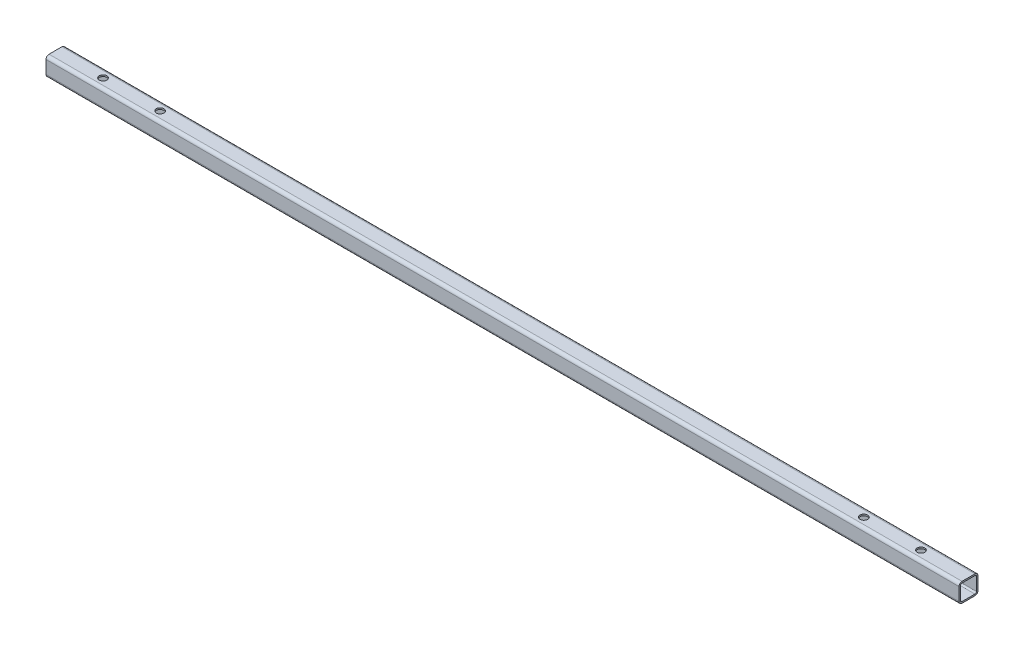
ISO-10303-21;
HEADER;
FILE_DESCRIPTION(('STEP AP214'),'2;1');
FILE_NAME('part.step','',(''),(''),'','','');
FILE_SCHEMA(('AUTOMOTIVE_DESIGN { 1 0 10303 214 1 1 1 1 }'));
ENDSEC;
DATA;
#1=APPLICATION_CONTEXT('core data for automotive mechanical design processes');
#2=APPLICATION_PROTOCOL_DEFINITION('international standard','automotive_design',2000,#1);
#3=PRODUCT_CONTEXT('',#1,'mechanical');
#4=PRODUCT('Part','Part','',(#3));
#5=PRODUCT_RELATED_PRODUCT_CATEGORY('part','',(#4));
#6=PRODUCT_DEFINITION_FORMATION('','',#4);
#7=PRODUCT_DEFINITION_CONTEXT('part definition',#1,'design');
#8=PRODUCT_DEFINITION('design','',#6,#7);
#9=PRODUCT_DEFINITION_SHAPE('','',#8);
#10=(LENGTH_UNIT() NAMED_UNIT(*) SI_UNIT(.MILLI.,.METRE.));
#11=(NAMED_UNIT(*) PLANE_ANGLE_UNIT() SI_UNIT($,.RADIAN.));
#12=(NAMED_UNIT(*) SI_UNIT($,.STERADIAN.) SOLID_ANGLE_UNIT());
#13=UNCERTAINTY_MEASURE_WITH_UNIT(LENGTH_MEASURE(1.E-05),#10,'distance_accuracy_value','');
#14=(GEOMETRIC_REPRESENTATION_CONTEXT(3) GLOBAL_UNCERTAINTY_ASSIGNED_CONTEXT((#13)) GLOBAL_UNIT_ASSIGNED_CONTEXT((#10,
#11,#12)) REPRESENTATION_CONTEXT('',''));
#15=CARTESIAN_POINT('',(0.,0.,0.));
#16=DIRECTION('',(0.,0.,1.));
#17=DIRECTION('',(1.,0.,0.));
#18=AXIS2_PLACEMENT_3D('',#15,#16,#17);
#19=CARTESIAN_POINT('',(1920.,13.6,-13.6));
#20=DIRECTION('',(-1.,0.,0.));
#21=DIRECTION('',(0.,0.,1.));
#22=AXIS2_PLACEMENT_3D('',#19,#20,#21);
#23=CYLINDRICAL_SURFACE('',#22,6.4);
#24=CARTESIAN_POINT('',(0.,13.6,-13.6));
#25=DIRECTION('',(1.,0.,0.));
#26=DIRECTION('',(0.,0.,-1.));
#27=AXIS2_PLACEMENT_3D('',#24,#25,#26);
#28=CIRCLE('',#27,6.4);
#29=CARTESIAN_POINT('',(0.,13.6,-20.));
#30=VERTEX_POINT('',#29);
#31=CARTESIAN_POINT('',(0.,20.,-13.6));
#32=VERTEX_POINT('',#31);
#33=EDGE_CURVE('E236',#30,#32,#28,.T.);
#34=ORIENTED_EDGE('',*,*,#33,.T.);
#35=DIRECTION('',(-1.,0.,0.));
#36=VECTOR('',#35,1.);
#37=CARTESIAN_POINT('',(1920.,20.,-13.6));
#38=LINE('',#37,#36);
#39=CARTESIAN_POINT('',(1920.,20.,-13.6));
#40=VERTEX_POINT('',#39);
#41=EDGE_CURVE('E12',#40,#32,#38,.T.);
#42=ORIENTED_EDGE('',*,*,#41,.F.);
#43=CARTESIAN_POINT('',(1920.,13.6,-13.6));
#44=DIRECTION('',(1.,0.,0.));
#45=DIRECTION('',(0.,0.,-1.));
#46=AXIS2_PLACEMENT_3D('',#43,#44,#45);
#47=CIRCLE('',#46,6.4);
#48=CARTESIAN_POINT('',(1920.,13.6,-20.));
#49=VERTEX_POINT('',#48);
#50=EDGE_CURVE('E323',#49,#40,#47,.T.);
#51=ORIENTED_EDGE('',*,*,#50,.F.);
#52=DIRECTION('',(-1.,0.,0.));
#53=VECTOR('',#52,1.);
#54=CARTESIAN_POINT('',(1920.,13.6,-20.));
#55=LINE('',#54,#53);
#56=EDGE_CURVE('E251',#49,#30,#55,.T.);
#57=ORIENTED_EDGE('',*,*,#56,.T.);
#58=EDGE_LOOP('',(#34,#42,#51,#57));
#59=FACE_BOUND('',#58,.T.);
#60=ADVANCED_FACE('F62',(#59),#23,.T.);
#61=CARTESIAN_POINT('',(1920.,20.,-13.6));
#62=DIRECTION('',(0.,-1.,0.));
#63=DIRECTION('',(0.,0.,-1.));
#64=AXIS2_PLACEMENT_3D('',#61,#62,#63);
#65=PLANE('',#64);
#66=CARTESIAN_POINT('',(1820.,20.,0.));
#67=DIRECTION('',(0.,1.,0.));
#68=DIRECTION('',(0.,0.,1.));
#69=AXIS2_PLACEMENT_3D('',#66,#67,#68);
#70=CIRCLE('',#69,7.99999999999998);
#71=CARTESIAN_POINT('',(1820.,20.,7.99999999999999));
#72=VERTEX_POINT('',#71);
#73=EDGE_CURVE('E473',#72,#72,#70,.T.);
#74=ORIENTED_EDGE('',*,*,#73,.F.);
#75=EDGE_LOOP('',(#74));
#76=FACE_BOUND('',#75,.T.);
#77=CARTESIAN_POINT('',(100.,20.,0.));
#78=DIRECTION('',(0.,1.,0.));
#79=DIRECTION('',(0.,0.,1.));
#80=AXIS2_PLACEMENT_3D('',#77,#78,#79);
#81=CIRCLE('',#80,8.00000000000001);
#82=CARTESIAN_POINT('',(100.,20.,8.00000000000001));
#83=VERTEX_POINT('',#82);
#84=EDGE_CURVE('E465',#83,#83,#81,.T.);
#85=ORIENTED_EDGE('',*,*,#84,.F.);
#86=EDGE_LOOP('',(#85));
#87=FACE_BOUND('',#86,.T.);
#88=CARTESIAN_POINT('',(220.,20.,0.));
#89=DIRECTION('',(0.,1.,0.));
#90=DIRECTION('',(0.,0.,1.));
#91=AXIS2_PLACEMENT_3D('',#88,#89,#90);
#92=CIRCLE('',#91,7.99999999999998);
#93=CARTESIAN_POINT('',(220.,20.,7.99999999999998));
#94=VERTEX_POINT('',#93);
#95=EDGE_CURVE('E458',#94,#94,#92,.T.);
#96=ORIENTED_EDGE('',*,*,#95,.F.);
#97=EDGE_LOOP('',(#96));
#98=FACE_BOUND('',#97,.T.);
#99=CARTESIAN_POINT('',(1700.,20.,0.));
#100=DIRECTION('',(0.,1.,0.));
#101=DIRECTION('',(0.,0.,1.));
#102=AXIS2_PLACEMENT_3D('',#99,#100,#101);
#103=CIRCLE('',#102,7.99999999999998);
#104=CARTESIAN_POINT('',(1700.,20.,7.99999999999999));
#105=VERTEX_POINT('',#104);
#106=EDGE_CURVE('E460',#105,#105,#103,.T.);
#107=ORIENTED_EDGE('',*,*,#106,.F.);
#108=EDGE_LOOP('',(#107));
#109=FACE_BOUND('',#108,.T.);
#110=DIRECTION('',(0.,0.,1.));
#111=VECTOR('',#110,1.);
#112=CARTESIAN_POINT('',(0.,20.,-13.6));
#113=LINE('',#112,#111);
#114=CARTESIAN_POINT('',(0.,20.,13.6));
#115=VERTEX_POINT('',#114);
#116=EDGE_CURVE('E239',#32,#115,#113,.T.);
#117=ORIENTED_EDGE('',*,*,#116,.T.);
#118=DIRECTION('',(-1.,0.,0.));
#119=VECTOR('',#118,1.);
#120=CARTESIAN_POINT('',(1920.,20.,13.6));
#121=LINE('',#120,#119);
#122=CARTESIAN_POINT('',(1920.,20.,13.6));
#123=VERTEX_POINT('',#122);
#124=EDGE_CURVE('E72',#123,#115,#121,.T.);
#125=ORIENTED_EDGE('',*,*,#124,.F.);
#126=DIRECTION('',(0.,0.,1.));
#127=VECTOR('',#126,1.);
#128=CARTESIAN_POINT('',(1920.,20.,-13.6));
#129=LINE('',#128,#127);
#130=EDGE_CURVE('E325',#40,#123,#129,.T.);
#131=ORIENTED_EDGE('',*,*,#130,.F.);
#132=ORIENTED_EDGE('',*,*,#41,.T.);
#133=EDGE_LOOP('',(#117,#125,#131,#132));
#134=FACE_BOUND('',#133,.T.);
#135=ADVANCED_FACE('F363',(#76,#87,#98,#109,#134),#65,.F.);
#136=CARTESIAN_POINT('',(1920.,13.6,13.6));
#137=DIRECTION('',(-1.,0.,0.));
#138=DIRECTION('',(0.,0.,1.));
#139=AXIS2_PLACEMENT_3D('',#136,#137,#138);
#140=CYLINDRICAL_SURFACE('',#139,6.4);
#141=CARTESIAN_POINT('',(0.,13.6,13.6));
#142=DIRECTION('',(1.,0.,0.));
#143=DIRECTION('',(0.,0.,-1.));
#144=AXIS2_PLACEMENT_3D('',#141,#142,#143);
#145=CIRCLE('',#144,6.4);
#146=CARTESIAN_POINT('',(0.,13.6,20.));
#147=VERTEX_POINT('',#146);
#148=EDGE_CURVE('E241',#115,#147,#145,.T.);
#149=ORIENTED_EDGE('',*,*,#148,.T.);
#150=DIRECTION('',(-1.,0.,0.));
#151=VECTOR('',#150,1.);
#152=CARTESIAN_POINT('',(1920.,13.6,20.));
#153=LINE('',#152,#151);
#154=CARTESIAN_POINT('',(1920.,13.6,20.));
#155=VERTEX_POINT('',#154);
#156=EDGE_CURVE('E258',#155,#147,#153,.T.);
#157=ORIENTED_EDGE('',*,*,#156,.F.);
#158=CARTESIAN_POINT('',(1920.,13.6,13.6));
#159=DIRECTION('',(1.,0.,0.));
#160=DIRECTION('',(0.,0.,-1.));
#161=AXIS2_PLACEMENT_3D('',#158,#159,#160);
#162=CIRCLE('',#161,6.4);
#163=EDGE_CURVE('E327',#123,#155,#162,.T.);
#164=ORIENTED_EDGE('',*,*,#163,.F.);
#165=ORIENTED_EDGE('',*,*,#124,.T.);
#166=EDGE_LOOP('',(#149,#157,#164,#165));
#167=FACE_BOUND('',#166,.T.);
#168=ADVANCED_FACE('F369',(#167),#140,.T.);
#169=CARTESIAN_POINT('',(1920.,-13.6,20.));
#170=DIRECTION('',(0.,0.,-1.));
#171=DIRECTION('',(0.,1.,0.));
#172=AXIS2_PLACEMENT_3D('',#169,#170,#171);
#173=PLANE('',#172);
#174=DIRECTION('',(0.,-1.,0.));
#175=VECTOR('',#174,1.);
#176=CARTESIAN_POINT('',(0.,-13.6,20.));
#177=LINE('',#176,#175);
#178=CARTESIAN_POINT('',(0.,-13.6,20.));
#179=VERTEX_POINT('',#178);
#180=EDGE_CURVE('E243',#147,#179,#177,.T.);
#181=ORIENTED_EDGE('',*,*,#180,.T.);
#182=DIRECTION('',(-1.,0.,0.));
#183=VECTOR('',#182,1.);
#184=CARTESIAN_POINT('',(1920.,-13.6,20.));
#185=LINE('',#184,#183);
#186=CARTESIAN_POINT('',(1920.,-13.6,20.));
#187=VERTEX_POINT('',#186);
#188=EDGE_CURVE('E255',#187,#179,#185,.T.);
#189=ORIENTED_EDGE('',*,*,#188,.F.);
#190=DIRECTION('',(0.,-1.,0.));
#191=VECTOR('',#190,1.);
#192=CARTESIAN_POINT('',(1920.,-13.6,20.));
#193=LINE('',#192,#191);
#194=EDGE_CURVE('E329',#155,#187,#193,.T.);
#195=ORIENTED_EDGE('',*,*,#194,.F.);
#196=ORIENTED_EDGE('',*,*,#156,.T.);
#197=EDGE_LOOP('',(#181,#189,#195,#196));
#198=FACE_BOUND('',#197,.T.);
#199=ADVANCED_FACE('F335',(#198),#173,.F.);
#200=CARTESIAN_POINT('',(1920.,-13.6,13.6));
#201=DIRECTION('',(-1.,0.,0.));
#202=DIRECTION('',(0.,0.,1.));
#203=AXIS2_PLACEMENT_3D('',#200,#201,#202);
#204=CYLINDRICAL_SURFACE('',#203,6.4);
#205=CARTESIAN_POINT('',(0.,-13.6,13.6));
#206=DIRECTION('',(1.,0.,0.));
#207=DIRECTION('',(0.,0.,-1.));
#208=AXIS2_PLACEMENT_3D('',#205,#206,#207);
#209=CIRCLE('',#208,6.4);
#210=CARTESIAN_POINT('',(0.,-20.,13.6));
#211=VERTEX_POINT('',#210);
#212=EDGE_CURVE('E245',#179,#211,#209,.T.);
#213=ORIENTED_EDGE('',*,*,#212,.T.);
#214=DIRECTION('',(-1.,0.,0.));
#215=VECTOR('',#214,1.);
#216=CARTESIAN_POINT('',(1920.,-20.,13.6));
#217=LINE('',#216,#215);
#218=CARTESIAN_POINT('',(1920.,-20.,13.6));
#219=VERTEX_POINT('',#218);
#220=EDGE_CURVE('E202',#219,#211,#217,.T.);
#221=ORIENTED_EDGE('',*,*,#220,.F.);
#222=CARTESIAN_POINT('',(1920.,-13.6,13.6));
#223=DIRECTION('',(1.,0.,0.));
#224=DIRECTION('',(0.,0.,-1.));
#225=AXIS2_PLACEMENT_3D('',#222,#223,#224);
#226=CIRCLE('',#225,6.4);
#227=EDGE_CURVE('E193',#187,#219,#226,.T.);
#228=ORIENTED_EDGE('',*,*,#227,.F.);
#229=ORIENTED_EDGE('',*,*,#188,.T.);
#230=EDGE_LOOP('',(#213,#221,#228,#229));
#231=FACE_BOUND('',#230,.T.);
#232=ADVANCED_FACE('F339',(#231),#204,.T.);
#233=CARTESIAN_POINT('',(1920.,-20.,13.6));
#234=DIRECTION('',(0.,1.,0.));
#235=DIRECTION('',(0.,0.,1.));
#236=AXIS2_PLACEMENT_3D('',#233,#234,#235);
#237=PLANE('',#236);
#238=CARTESIAN_POINT('',(1820.,-20.,0.));
#239=DIRECTION('',(0.,1.,0.));
#240=DIRECTION('',(0.,0.,1.));
#241=AXIS2_PLACEMENT_3D('',#238,#239,#240);
#242=CIRCLE('',#241,7.99999999999998);
#243=CARTESIAN_POINT('',(1820.,-20.,7.99999999999998));
#244=VERTEX_POINT('',#243);
#245=EDGE_CURVE('E476',#244,#244,#242,.T.);
#246=ORIENTED_EDGE('',*,*,#245,.T.);
#247=EDGE_LOOP('',(#246));
#248=FACE_BOUND('',#247,.T.);
#249=CARTESIAN_POINT('',(100.,-20.,0.));
#250=DIRECTION('',(0.,1.,0.));
#251=DIRECTION('',(0.,0.,1.));
#252=AXIS2_PLACEMENT_3D('',#249,#250,#251);
#253=CIRCLE('',#252,8.00000000000001);
#254=CARTESIAN_POINT('',(100.,-20.,8.00000000000001));
#255=VERTEX_POINT('',#254);
#256=EDGE_CURVE('E470',#255,#255,#253,.T.);
#257=ORIENTED_EDGE('',*,*,#256,.T.);
#258=EDGE_LOOP('',(#257));
#259=FACE_BOUND('',#258,.T.);
#260=CARTESIAN_POINT('',(220.,-20.,0.));
#261=DIRECTION('',(0.,1.,0.));
#262=DIRECTION('',(0.,0.,1.));
#263=AXIS2_PLACEMENT_3D('',#260,#261,#262);
#264=CIRCLE('',#263,7.99999999999998);
#265=CARTESIAN_POINT('',(220.,-20.,7.99999999999998));
#266=VERTEX_POINT('',#265);
#267=EDGE_CURVE('E461',#266,#266,#264,.T.);
#268=ORIENTED_EDGE('',*,*,#267,.T.);
#269=EDGE_LOOP('',(#268));
#270=FACE_BOUND('',#269,.T.);
#271=CARTESIAN_POINT('',(1700.,-20.,0.));
#272=DIRECTION('',(0.,1.,0.));
#273=DIRECTION('',(0.,0.,1.));
#274=AXIS2_PLACEMENT_3D('',#271,#272,#273);
#275=CIRCLE('',#274,7.99999999999998);
#276=CARTESIAN_POINT('',(1700.,-20.,7.99999999999998));
#277=VERTEX_POINT('',#276);
#278=EDGE_CURVE('E281',#277,#277,#275,.T.);
#279=ORIENTED_EDGE('',*,*,#278,.T.);
#280=EDGE_LOOP('',(#279));
#281=FACE_BOUND('',#280,.T.);
#282=DIRECTION('',(0.,0.,-1.));
#283=VECTOR('',#282,1.);
#284=CARTESIAN_POINT('',(0.,-20.,13.6));
#285=LINE('',#284,#283);
#286=CARTESIAN_POINT('',(0.,-20.,-13.6));
#287=VERTEX_POINT('',#286);
#288=EDGE_CURVE('E201',#211,#287,#285,.T.);
#289=ORIENTED_EDGE('',*,*,#288,.T.);
#290=DIRECTION('',(-1.,0.,0.));
#291=VECTOR('',#290,1.);
#292=CARTESIAN_POINT('',(1920.,-20.,-13.6));
#293=LINE('',#292,#291);
#294=CARTESIAN_POINT('',(1920.,-20.,-13.6));
#295=VERTEX_POINT('',#294);
#296=EDGE_CURVE('E198',#295,#287,#293,.T.);
#297=ORIENTED_EDGE('',*,*,#296,.F.);
#298=DIRECTION('',(0.,0.,-1.));
#299=VECTOR('',#298,1.);
#300=CARTESIAN_POINT('',(1920.,-20.,13.6));
#301=LINE('',#300,#299);
#302=EDGE_CURVE('E187',#219,#295,#301,.T.);
#303=ORIENTED_EDGE('',*,*,#302,.F.);
#304=ORIENTED_EDGE('',*,*,#220,.T.);
#305=EDGE_LOOP('',(#289,#297,#303,#304));
#306=FACE_BOUND('',#305,.T.);
#307=ADVANCED_FACE('F199',(#248,#259,#270,#281,#306),#237,.F.);
#308=CARTESIAN_POINT('',(1920.,-13.6,-13.6));
#309=DIRECTION('',(-1.,0.,0.));
#310=DIRECTION('',(0.,0.,1.));
#311=AXIS2_PLACEMENT_3D('',#308,#309,#310);
#312=CYLINDRICAL_SURFACE('',#311,6.4);
#313=CARTESIAN_POINT('',(0.,-13.6,-13.6));
#314=DIRECTION('',(1.,0.,0.));
#315=DIRECTION('',(0.,0.,-1.));
#316=AXIS2_PLACEMENT_3D('',#313,#314,#315);
#317=CIRCLE('',#316,6.4);
#318=CARTESIAN_POINT('',(0.,-13.6,-20.));
#319=VERTEX_POINT('',#318);
#320=EDGE_CURVE('E134',#287,#319,#317,.T.);
#321=ORIENTED_EDGE('',*,*,#320,.T.);
#322=DIRECTION('',(-1.,0.,0.));
#323=VECTOR('',#322,1.);
#324=CARTESIAN_POINT('',(1920.,-13.6,-20.));
#325=LINE('',#324,#323);
#326=CARTESIAN_POINT('',(1920.,-13.6,-20.));
#327=VERTEX_POINT('',#326);
#328=EDGE_CURVE('E203',#327,#319,#325,.T.);
#329=ORIENTED_EDGE('',*,*,#328,.F.);
#330=CARTESIAN_POINT('',(1920.,-13.6,-13.6));
#331=DIRECTION('',(1.,0.,0.));
#332=DIRECTION('',(0.,0.,-1.));
#333=AXIS2_PLACEMENT_3D('',#330,#331,#332);
#334=CIRCLE('',#333,6.4);
#335=EDGE_CURVE('E191',#295,#327,#334,.T.);
#336=ORIENTED_EDGE('',*,*,#335,.F.);
#337=ORIENTED_EDGE('',*,*,#296,.T.);
#338=EDGE_LOOP('',(#321,#329,#336,#337));
#339=FACE_BOUND('',#338,.T.);
#340=ADVANCED_FACE('F205',(#339),#312,.T.);
#341=CARTESIAN_POINT('',(1920.,13.6,13.6));
#342=DIRECTION('',(-1.,0.,0.));
#343=DIRECTION('',(0.,0.,1.));
#344=AXIS2_PLACEMENT_3D('',#341,#342,#343);
#345=CYLINDRICAL_SURFACE('',#344,3.2);
#346=CARTESIAN_POINT('',(0.,13.6,13.6));
#347=DIRECTION('',(1.,0.,0.));
#348=DIRECTION('',(0.,0.,-1.));
#349=AXIS2_PLACEMENT_3D('',#346,#347,#348);
#350=CIRCLE('',#349,3.2);
#351=CARTESIAN_POINT('',(0.,16.8,13.6));
#352=VERTEX_POINT('',#351);
#353=CARTESIAN_POINT('',(0.,13.6,16.8));
#354=VERTEX_POINT('',#353);
#355=EDGE_CURVE('E211',#352,#354,#350,.T.);
#356=ORIENTED_EDGE('',*,*,#355,.F.);
#357=DIRECTION('',(-1.,0.,0.));
#358=VECTOR('',#357,1.);
#359=CARTESIAN_POINT('',(1920.,16.8,13.6));
#360=LINE('',#359,#358);
#361=CARTESIAN_POINT('',(1920.,16.8,13.6));
#362=VERTEX_POINT('',#361);
#363=EDGE_CURVE('E148',#362,#352,#360,.T.);
#364=ORIENTED_EDGE('',*,*,#363,.F.);
#365=CARTESIAN_POINT('',(1920.,13.6,13.6));
#366=DIRECTION('',(1.,0.,0.));
#367=DIRECTION('',(0.,0.,-1.));
#368=AXIS2_PLACEMENT_3D('',#365,#366,#367);
#369=CIRCLE('',#368,3.2);
#370=CARTESIAN_POINT('',(1920.,13.6,16.8));
#371=VERTEX_POINT('',#370);
#372=EDGE_CURVE('E250',#362,#371,#369,.T.);
#373=ORIENTED_EDGE('',*,*,#372,.T.);
#374=DIRECTION('',(-1.,0.,0.));
#375=VECTOR('',#374,1.);
#376=CARTESIAN_POINT('',(1920.,13.6,16.8));
#377=LINE('',#376,#375);
#378=EDGE_CURVE('E207',#371,#354,#377,.T.);
#379=ORIENTED_EDGE('',*,*,#378,.T.);
#380=EDGE_LOOP('',(#356,#364,#373,#379));
#381=FACE_BOUND('',#380,.T.);
#382=ADVANCED_FACE('F64',(#381),#345,.F.);
#383=CARTESIAN_POINT('',(1920.,16.8,-13.6));
#384=DIRECTION('',(0.,-1.,0.));
#385=DIRECTION('',(0.,0.,-1.));
#386=AXIS2_PLACEMENT_3D('',#383,#384,#385);
#387=PLANE('',#386);
#388=CARTESIAN_POINT('',(1820.,16.8,0.));
#389=DIRECTION('',(0.,-1.,0.));
#390=DIRECTION('',(0.,0.,-1.));
#391=AXIS2_PLACEMENT_3D('',#388,#389,#390);
#392=CIRCLE('',#391,7.99999999999998);
#393=CARTESIAN_POINT('',(1820.,16.8,-7.99999999999998));
#394=VERTEX_POINT('',#393);
#395=EDGE_CURVE('E215',#394,#394,#392,.T.);
#396=ORIENTED_EDGE('',*,*,#395,.F.);
#397=EDGE_LOOP('',(#396));
#398=FACE_BOUND('',#397,.T.);
#399=CARTESIAN_POINT('',(100.,16.8,0.));
#400=DIRECTION('',(0.,-1.,0.));
#401=DIRECTION('',(0.,0.,-1.));
#402=AXIS2_PLACEMENT_3D('',#399,#400,#401);
#403=CIRCLE('',#402,8.00000000000001);
#404=CARTESIAN_POINT('',(100.,16.8,-8.00000000000001));
#405=VERTEX_POINT('',#404);
#406=EDGE_CURVE('E287',#405,#405,#403,.T.);
#407=ORIENTED_EDGE('',*,*,#406,.F.);
#408=EDGE_LOOP('',(#407));
#409=FACE_BOUND('',#408,.T.);
#410=CARTESIAN_POINT('',(220.,16.8,0.));
#411=DIRECTION('',(0.,-1.,0.));
#412=DIRECTION('',(0.,0.,-1.));
#413=AXIS2_PLACEMENT_3D('',#410,#411,#412);
#414=CIRCLE('',#413,7.99999999999998);
#415=CARTESIAN_POINT('',(220.,16.8,-7.99999999999998));
#416=VERTEX_POINT('',#415);
#417=EDGE_CURVE('E284',#416,#416,#414,.T.);
#418=ORIENTED_EDGE('',*,*,#417,.F.);
#419=EDGE_LOOP('',(#418));
#420=FACE_BOUND('',#419,.T.);
#421=CARTESIAN_POINT('',(1700.,16.8,0.));
#422=DIRECTION('',(0.,-1.,0.));
#423=DIRECTION('',(0.,0.,-1.));
#424=AXIS2_PLACEMENT_3D('',#421,#422,#423);
#425=CIRCLE('',#424,7.99999999999998);
#426=CARTESIAN_POINT('',(1700.,16.8,-7.99999999999998));
#427=VERTEX_POINT('',#426);
#428=EDGE_CURVE('E280',#427,#427,#425,.T.);
#429=ORIENTED_EDGE('',*,*,#428,.F.);
#430=EDGE_LOOP('',(#429));
#431=FACE_BOUND('',#430,.T.);
#432=DIRECTION('',(0.,0.,1.));
#433=VECTOR('',#432,1.);
#434=CARTESIAN_POINT('',(0.,16.8,-13.6));
#435=LINE('',#434,#433);
#436=CARTESIAN_POINT('',(0.,16.8,-13.6));
#437=VERTEX_POINT('',#436);
#438=EDGE_CURVE('E214',#437,#352,#435,.T.);
#439=ORIENTED_EDGE('',*,*,#438,.F.);
#440=DIRECTION('',(-1.,0.,0.));
#441=VECTOR('',#440,1.);
#442=CARTESIAN_POINT('',(1920.,16.8,-13.6));
#443=LINE('',#442,#441);
#444=CARTESIAN_POINT('',(1920.,16.8,-13.6));
#445=VERTEX_POINT('',#444);
#446=EDGE_CURVE('E274',#445,#437,#443,.T.);
#447=ORIENTED_EDGE('',*,*,#446,.F.);
#448=DIRECTION('',(0.,0.,1.));
#449=VECTOR('',#448,1.);
#450=CARTESIAN_POINT('',(1920.,16.8,-13.6));
#451=LINE('',#450,#449);
#452=EDGE_CURVE('E302',#445,#362,#451,.T.);
#453=ORIENTED_EDGE('',*,*,#452,.T.);
#454=ORIENTED_EDGE('',*,*,#363,.T.);
#455=EDGE_LOOP('',(#439,#447,#453,#454));
#456=FACE_BOUND('',#455,.T.);
#457=ADVANCED_FACE('F391',(#398,#409,#420,#431,#456),#387,.T.);
#458=CARTESIAN_POINT('',(1920.,13.6,-13.6));
#459=DIRECTION('',(-1.,0.,0.));
#460=DIRECTION('',(0.,0.,1.));
#461=AXIS2_PLACEMENT_3D('',#458,#459,#460);
#462=CYLINDRICAL_SURFACE('',#461,3.2);
#463=CARTESIAN_POINT('',(0.,13.6,-13.6));
#464=DIRECTION('',(1.,0.,0.));
#465=DIRECTION('',(0.,0.,-1.));
#466=AXIS2_PLACEMENT_3D('',#463,#464,#465);
#467=CIRCLE('',#466,3.2);
#468=CARTESIAN_POINT('',(0.,13.6,-16.8));
#469=VERTEX_POINT('',#468);
#470=EDGE_CURVE('E218',#469,#437,#467,.T.);
#471=ORIENTED_EDGE('',*,*,#470,.F.);
#472=DIRECTION('',(-1.,0.,0.));
#473=VECTOR('',#472,1.);
#474=CARTESIAN_POINT('',(1920.,13.6,-16.8));
#475=LINE('',#474,#473);
#476=CARTESIAN_POINT('',(1920.,13.6,-16.8));
#477=VERTEX_POINT('',#476);
#478=EDGE_CURVE('E272',#477,#469,#475,.T.);
#479=ORIENTED_EDGE('',*,*,#478,.F.);
#480=CARTESIAN_POINT('',(1920.,13.6,-13.6));
#481=DIRECTION('',(1.,0.,0.));
#482=DIRECTION('',(0.,0.,-1.));
#483=AXIS2_PLACEMENT_3D('',#480,#481,#482);
#484=CIRCLE('',#483,3.2);
#485=EDGE_CURVE('E305',#477,#445,#484,.T.);
#486=ORIENTED_EDGE('',*,*,#485,.T.);
#487=ORIENTED_EDGE('',*,*,#446,.T.);
#488=EDGE_LOOP('',(#471,#479,#486,#487));
#489=FACE_BOUND('',#488,.T.);
#490=ADVANCED_FACE('F388',(#489),#462,.F.);
#491=CARTESIAN_POINT('',(1920.,13.6,-16.8));
#492=DIRECTION('',(0.,0.,1.));
#493=DIRECTION('',(1.,0.,0.));
#494=AXIS2_PLACEMENT_3D('',#491,#492,#493);
#495=PLANE('',#494);
#496=DIRECTION('',(0.,1.,0.));
#497=VECTOR('',#496,1.);
#498=CARTESIAN_POINT('',(0.,13.6,-16.8));
#499=LINE('',#498,#497);
#500=CARTESIAN_POINT('',(0.,-13.6,-16.8));
#501=VERTEX_POINT('',#500);
#502=EDGE_CURVE('E221',#501,#469,#499,.T.);
#503=ORIENTED_EDGE('',*,*,#502,.F.);
#504=DIRECTION('',(-1.,0.,0.));
#505=VECTOR('',#504,1.);
#506=CARTESIAN_POINT('',(1920.,-13.6,-16.8));
#507=LINE('',#506,#505);
#508=CARTESIAN_POINT('',(1920.,-13.6,-16.8));
#509=VERTEX_POINT('',#508);
#510=EDGE_CURVE('E270',#509,#501,#507,.T.);
#511=ORIENTED_EDGE('',*,*,#510,.F.);
#512=DIRECTION('',(0.,1.,0.));
#513=VECTOR('',#512,1.);
#514=CARTESIAN_POINT('',(1920.,13.6,-16.8));
#515=LINE('',#514,#513);
#516=EDGE_CURVE('E308',#509,#477,#515,.T.);
#517=ORIENTED_EDGE('',*,*,#516,.T.);
#518=ORIENTED_EDGE('',*,*,#478,.T.);
#519=EDGE_LOOP('',(#503,#511,#517,#518));
#520=FACE_BOUND('',#519,.T.);
#521=ADVANCED_FACE('F384',(#520),#495,.T.);
#522=CARTESIAN_POINT('',(1920.,-13.6,-13.6));
#523=DIRECTION('',(-1.,0.,0.));
#524=DIRECTION('',(0.,0.,1.));
#525=AXIS2_PLACEMENT_3D('',#522,#523,#524);
#526=CYLINDRICAL_SURFACE('',#525,3.2);
#527=CARTESIAN_POINT('',(0.,-13.6,-13.6));
#528=DIRECTION('',(1.,0.,0.));
#529=DIRECTION('',(0.,0.,-1.));
#530=AXIS2_PLACEMENT_3D('',#527,#528,#529);
#531=CIRCLE('',#530,3.2);
#532=CARTESIAN_POINT('',(0.,-16.8,-13.6));
#533=VERTEX_POINT('',#532);
#534=EDGE_CURVE('E224',#533,#501,#531,.T.);
#535=ORIENTED_EDGE('',*,*,#534,.F.);
#536=DIRECTION('',(-1.,0.,0.));
#537=VECTOR('',#536,1.);
#538=CARTESIAN_POINT('',(1920.,-16.8,-13.6));
#539=LINE('',#538,#537);
#540=CARTESIAN_POINT('',(1920.,-16.8,-13.6));
#541=VERTEX_POINT('',#540);
#542=EDGE_CURVE('E268',#541,#533,#539,.T.);
#543=ORIENTED_EDGE('',*,*,#542,.F.);
#544=CARTESIAN_POINT('',(1920.,-13.6,-13.6));
#545=DIRECTION('',(1.,0.,0.));
#546=DIRECTION('',(0.,0.,-1.));
#547=AXIS2_PLACEMENT_3D('',#544,#545,#546);
#548=CIRCLE('',#547,3.2);
#549=EDGE_CURVE('E311',#541,#509,#548,.T.);
#550=ORIENTED_EDGE('',*,*,#549,.T.);
#551=ORIENTED_EDGE('',*,*,#510,.T.);
#552=EDGE_LOOP('',(#535,#543,#550,#551));
#553=FACE_BOUND('',#552,.T.);
#554=ADVANCED_FACE('F380',(#553),#526,.F.);
#555=CARTESIAN_POINT('',(1920.,-16.8,13.6));
#556=DIRECTION('',(0.,1.,0.));
#557=DIRECTION('',(0.,0.,1.));
#558=AXIS2_PLACEMENT_3D('',#555,#556,#557);
#559=PLANE('',#558);
#560=CARTESIAN_POINT('',(1820.,-16.8,0.));
#561=DIRECTION('',(0.,1.,0.));
#562=DIRECTION('',(0.,0.,1.));
#563=AXIS2_PLACEMENT_3D('',#560,#561,#562);
#564=CIRCLE('',#563,7.99999999999998);
#565=CARTESIAN_POINT('',(1820.,-16.8,7.99999999999998));
#566=VERTEX_POINT('',#565);
#567=EDGE_CURVE('E66',#566,#566,#564,.T.);
#568=ORIENTED_EDGE('',*,*,#567,.F.);
#569=EDGE_LOOP('',(#568));
#570=FACE_BOUND('',#569,.T.);
#571=CARTESIAN_POINT('',(100.,-16.8,0.));
#572=DIRECTION('',(0.,1.,0.));
#573=DIRECTION('',(0.,0.,1.));
#574=AXIS2_PLACEMENT_3D('',#571,#572,#573);
#575=CIRCLE('',#574,8.00000000000001);
#576=CARTESIAN_POINT('',(100.,-16.8,8.00000000000001));
#577=VERTEX_POINT('',#576);
#578=EDGE_CURVE('E285',#577,#577,#575,.T.);
#579=ORIENTED_EDGE('',*,*,#578,.F.);
#580=EDGE_LOOP('',(#579));
#581=FACE_BOUND('',#580,.T.);
#582=CARTESIAN_POINT('',(220.,-16.8,0.));
#583=DIRECTION('',(0.,1.,0.));
#584=DIRECTION('',(0.,0.,1.));
#585=AXIS2_PLACEMENT_3D('',#582,#583,#584);
#586=CIRCLE('',#585,7.99999999999998);
#587=CARTESIAN_POINT('',(220.,-16.8,7.99999999999998));
#588=VERTEX_POINT('',#587);
#589=EDGE_CURVE('E282',#588,#588,#586,.T.);
#590=ORIENTED_EDGE('',*,*,#589,.F.);
#591=EDGE_LOOP('',(#590));
#592=FACE_BOUND('',#591,.T.);
#593=CARTESIAN_POINT('',(1700.,-16.8,0.));
#594=DIRECTION('',(0.,1.,0.));
#595=DIRECTION('',(0.,0.,1.));
#596=AXIS2_PLACEMENT_3D('',#593,#594,#595);
#597=CIRCLE('',#596,7.99999999999998);
#598=CARTESIAN_POINT('',(1700.,-16.8,7.99999999999998));
#599=VERTEX_POINT('',#598);
#600=EDGE_CURVE('E277',#599,#599,#597,.T.);
#601=ORIENTED_EDGE('',*,*,#600,.F.);
#602=EDGE_LOOP('',(#601));
#603=FACE_BOUND('',#602,.T.);
#604=DIRECTION('',(0.,0.,-1.));
#605=VECTOR('',#604,1.);
#606=CARTESIAN_POINT('',(0.,-16.8,13.6));
#607=LINE('',#606,#605);
#608=CARTESIAN_POINT('',(0.,-16.8,13.6));
#609=VERTEX_POINT('',#608);
#610=EDGE_CURVE('E227',#609,#533,#607,.T.);
#611=ORIENTED_EDGE('',*,*,#610,.F.);
#612=DIRECTION('',(-1.,0.,0.));
#613=VECTOR('',#612,1.);
#614=CARTESIAN_POINT('',(1920.,-16.8,13.6));
#615=LINE('',#614,#613);
#616=CARTESIAN_POINT('',(1920.,-16.8,13.6));
#617=VERTEX_POINT('',#616);
#618=EDGE_CURVE('E266',#617,#609,#615,.T.);
#619=ORIENTED_EDGE('',*,*,#618,.F.);
#620=DIRECTION('',(0.,0.,-1.));
#621=VECTOR('',#620,1.);
#622=CARTESIAN_POINT('',(1920.,-16.8,13.6));
#623=LINE('',#622,#621);
#624=EDGE_CURVE('E314',#617,#541,#623,.T.);
#625=ORIENTED_EDGE('',*,*,#624,.T.);
#626=ORIENTED_EDGE('',*,*,#542,.T.);
#627=EDGE_LOOP('',(#611,#619,#625,#626));
#628=FACE_BOUND('',#627,.T.);
#629=ADVANCED_FACE('F376',(#570,#581,#592,#603,#628),#559,.T.);
#630=CARTESIAN_POINT('',(1920.,-13.6,13.6));
#631=DIRECTION('',(-1.,0.,0.));
#632=DIRECTION('',(0.,0.,1.));
#633=AXIS2_PLACEMENT_3D('',#630,#631,#632);
#634=CYLINDRICAL_SURFACE('',#633,3.2);
#635=CARTESIAN_POINT('',(0.,-13.6,13.6));
#636=DIRECTION('',(1.,0.,0.));
#637=DIRECTION('',(0.,0.,-1.));
#638=AXIS2_PLACEMENT_3D('',#635,#636,#637);
#639=CIRCLE('',#638,3.2);
#640=CARTESIAN_POINT('',(0.,-13.6,16.8));
#641=VERTEX_POINT('',#640);
#642=EDGE_CURVE('E230',#641,#609,#639,.T.);
#643=ORIENTED_EDGE('',*,*,#642,.F.);
#644=DIRECTION('',(-1.,0.,0.));
#645=VECTOR('',#644,1.);
#646=CARTESIAN_POINT('',(1920.,-13.6,16.8));
#647=LINE('',#646,#645);
#648=CARTESIAN_POINT('',(1920.,-13.6,16.8));
#649=VERTEX_POINT('',#648);
#650=EDGE_CURVE('E264',#649,#641,#647,.T.);
#651=ORIENTED_EDGE('',*,*,#650,.F.);
#652=CARTESIAN_POINT('',(1920.,-13.6,13.6));
#653=DIRECTION('',(1.,0.,0.));
#654=DIRECTION('',(0.,0.,-1.));
#655=AXIS2_PLACEMENT_3D('',#652,#653,#654);
#656=CIRCLE('',#655,3.2);
#657=EDGE_CURVE('E317',#649,#617,#656,.T.);
#658=ORIENTED_EDGE('',*,*,#657,.T.);
#659=ORIENTED_EDGE('',*,*,#618,.T.);
#660=EDGE_LOOP('',(#643,#651,#658,#659));
#661=FACE_BOUND('',#660,.T.);
#662=ADVANCED_FACE('F357',(#661),#634,.F.);
#663=CARTESIAN_POINT('',(1920.,-13.6,16.8));
#664=DIRECTION('',(0.,0.,-1.));
#665=DIRECTION('',(0.,1.,0.));
#666=AXIS2_PLACEMENT_3D('',#663,#664,#665);
#667=PLANE('',#666);
#668=DIRECTION('',(0.,-1.,0.));
#669=VECTOR('',#668,1.);
#670=CARTESIAN_POINT('',(0.,-13.6,16.8));
#671=LINE('',#670,#669);
#672=EDGE_CURVE('E233',#354,#641,#671,.T.);
#673=ORIENTED_EDGE('',*,*,#672,.F.);
#674=ORIENTED_EDGE('',*,*,#378,.F.);
#675=DIRECTION('',(0.,-1.,0.));
#676=VECTOR('',#675,1.);
#677=CARTESIAN_POINT('',(1920.,-13.6,16.8));
#678=LINE('',#677,#676);
#679=EDGE_CURVE('E320',#371,#649,#678,.T.);
#680=ORIENTED_EDGE('',*,*,#679,.T.);
#681=ORIENTED_EDGE('',*,*,#650,.T.);
#682=EDGE_LOOP('',(#673,#674,#680,#681));
#683=FACE_BOUND('',#682,.T.);
#684=ADVANCED_FACE('F349',(#683),#667,.T.);
#685=CARTESIAN_POINT('',(1920.,13.6,-20.));
#686=DIRECTION('',(0.,0.,1.));
#687=DIRECTION('',(1.,0.,0.));
#688=AXIS2_PLACEMENT_3D('',#685,#686,#687);
#689=PLANE('',#688);
#690=DIRECTION('',(0.,1.,0.));
#691=VECTOR('',#690,1.);
#692=CARTESIAN_POINT('',(0.,13.6,-20.));
#693=LINE('',#692,#691);
#694=EDGE_CURVE('E140',#319,#30,#693,.T.);
#695=ORIENTED_EDGE('',*,*,#694,.T.);
#696=ORIENTED_EDGE('',*,*,#56,.F.);
#697=DIRECTION('',(0.,1.,0.));
#698=VECTOR('',#697,1.);
#699=CARTESIAN_POINT('',(1920.,13.6,-20.));
#700=LINE('',#699,#698);
#701=EDGE_CURVE('E81',#327,#49,#700,.T.);
#702=ORIENTED_EDGE('',*,*,#701,.F.);
#703=ORIENTED_EDGE('',*,*,#328,.T.);
#704=EDGE_LOOP('',(#695,#696,#702,#703));
#705=FACE_BOUND('',#704,.T.);
#706=ADVANCED_FACE('F347',(#705),#689,.F.);
#707=CARTESIAN_POINT('',(1920.,13.6,-13.6));
#708=DIRECTION('',(1.,0.,0.));
#709=DIRECTION('',(0.,0.,-1.));
#710=AXIS2_PLACEMENT_3D('',#707,#708,#709);
#711=PLANE('',#710);
#712=ORIENTED_EDGE('',*,*,#372,.F.);
#713=ORIENTED_EDGE('',*,*,#452,.F.);
#714=ORIENTED_EDGE('',*,*,#485,.F.);
#715=ORIENTED_EDGE('',*,*,#516,.F.);
#716=ORIENTED_EDGE('',*,*,#549,.F.);
#717=ORIENTED_EDGE('',*,*,#624,.F.);
#718=ORIENTED_EDGE('',*,*,#657,.F.);
#719=ORIENTED_EDGE('',*,*,#679,.F.);
#720=EDGE_LOOP('',(#712,#713,#714,#715,#716,#717,#718,#719));
#721=FACE_BOUND('',#720,.T.);
#722=ORIENTED_EDGE('',*,*,#50,.T.);
#723=ORIENTED_EDGE('',*,*,#130,.T.);
#724=ORIENTED_EDGE('',*,*,#163,.T.);
#725=ORIENTED_EDGE('',*,*,#194,.T.);
#726=ORIENTED_EDGE('',*,*,#227,.T.);
#727=ORIENTED_EDGE('',*,*,#302,.T.);
#728=ORIENTED_EDGE('',*,*,#335,.T.);
#729=ORIENTED_EDGE('',*,*,#701,.T.);
#730=EDGE_LOOP('',(#722,#723,#724,#725,#726,#727,#728,#729));
#731=FACE_BOUND('',#730,.T.);
#732=ADVANCED_FACE('F189',(#721,#731),#711,.T.);
#733=CARTESIAN_POINT('',(0.,13.6,-13.6));
#734=DIRECTION('',(1.,0.,0.));
#735=DIRECTION('',(0.,0.,-1.));
#736=AXIS2_PLACEMENT_3D('',#733,#734,#735);
#737=PLANE('',#736);
#738=ORIENTED_EDGE('',*,*,#355,.T.);
#739=ORIENTED_EDGE('',*,*,#672,.T.);
#740=ORIENTED_EDGE('',*,*,#642,.T.);
#741=ORIENTED_EDGE('',*,*,#610,.T.);
#742=ORIENTED_EDGE('',*,*,#534,.T.);
#743=ORIENTED_EDGE('',*,*,#502,.T.);
#744=ORIENTED_EDGE('',*,*,#470,.T.);
#745=ORIENTED_EDGE('',*,*,#438,.T.);
#746=EDGE_LOOP('',(#738,#739,#740,#741,#742,#743,#744,#745));
#747=FACE_BOUND('',#746,.T.);
#748=ORIENTED_EDGE('',*,*,#33,.F.);
#749=ORIENTED_EDGE('',*,*,#694,.F.);
#750=ORIENTED_EDGE('',*,*,#320,.F.);
#751=ORIENTED_EDGE('',*,*,#288,.F.);
#752=ORIENTED_EDGE('',*,*,#212,.F.);
#753=ORIENTED_EDGE('',*,*,#180,.F.);
#754=ORIENTED_EDGE('',*,*,#148,.F.);
#755=ORIENTED_EDGE('',*,*,#116,.F.);
#756=EDGE_LOOP('',(#748,#749,#750,#751,#752,#753,#754,#755));
#757=FACE_BOUND('',#756,.T.);
#758=ADVANCED_FACE('F342',(#747,#757),#737,.F.);
#759=CARTESIAN_POINT('',(1700.,-20.,0.));
#760=DIRECTION('',(0.,1.,0.));
#761=DIRECTION('',(0.,0.,1.));
#762=AXIS2_PLACEMENT_3D('',#759,#760,#761);
#763=CYLINDRICAL_SURFACE('',#762,7.99999999999998);
#764=ORIENTED_EDGE('',*,*,#600,.T.);
#765=EDGE_LOOP('',(#764));
#766=FACE_BOUND('',#765,.T.);
#767=ORIENTED_EDGE('',*,*,#278,.F.);
#768=EDGE_LOOP('',(#767));
#769=FACE_BOUND('',#768,.T.);
#770=ADVANCED_FACE('F424',(#766,#769),#763,.F.);
#771=CARTESIAN_POINT('',(220.,-20.,0.));
#772=DIRECTION('',(0.,1.,0.));
#773=DIRECTION('',(0.,0.,1.));
#774=AXIS2_PLACEMENT_3D('',#771,#772,#773);
#775=CYLINDRICAL_SURFACE('',#774,7.99999999999998);
#776=ORIENTED_EDGE('',*,*,#589,.T.);
#777=EDGE_LOOP('',(#776));
#778=FACE_BOUND('',#777,.T.);
#779=ORIENTED_EDGE('',*,*,#267,.F.);
#780=EDGE_LOOP('',(#779));
#781=FACE_BOUND('',#780,.T.);
#782=ADVANCED_FACE('F428',(#778,#781),#775,.F.);
#783=CARTESIAN_POINT('',(100.,-20.,0.));
#784=DIRECTION('',(0.,1.,0.));
#785=DIRECTION('',(0.,0.,1.));
#786=AXIS2_PLACEMENT_3D('',#783,#784,#785);
#787=CYLINDRICAL_SURFACE('',#786,8.00000000000001);
#788=ORIENTED_EDGE('',*,*,#578,.T.);
#789=EDGE_LOOP('',(#788));
#790=FACE_BOUND('',#789,.T.);
#791=ORIENTED_EDGE('',*,*,#256,.F.);
#792=EDGE_LOOP('',(#791));
#793=FACE_BOUND('',#792,.T.);
#794=ADVANCED_FACE('F436',(#790,#793),#787,.F.);
#795=CARTESIAN_POINT('',(1820.,-20.,0.));
#796=DIRECTION('',(0.,1.,0.));
#797=DIRECTION('',(0.,0.,1.));
#798=AXIS2_PLACEMENT_3D('',#795,#796,#797);
#799=CYLINDRICAL_SURFACE('',#798,7.99999999999998);
#800=ORIENTED_EDGE('',*,*,#567,.T.);
#801=EDGE_LOOP('',(#800));
#802=FACE_BOUND('',#801,.T.);
#803=ORIENTED_EDGE('',*,*,#245,.F.);
#804=EDGE_LOOP('',(#803));
#805=FACE_BOUND('',#804,.T.);
#806=ADVANCED_FACE('F433',(#802,#805),#799,.F.);
#807=ORIENTED_EDGE('',*,*,#428,.T.);
#808=EDGE_LOOP('',(#807));
#809=FACE_BOUND('',#808,.T.);
#810=ORIENTED_EDGE('',*,*,#106,.T.);
#811=EDGE_LOOP('',(#810));
#812=FACE_BOUND('',#811,.T.);
#813=ADVANCED_FACE('F431',(#809,#812),#763,.F.);
#814=ORIENTED_EDGE('',*,*,#417,.T.);
#815=EDGE_LOOP('',(#814));
#816=FACE_BOUND('',#815,.T.);
#817=ORIENTED_EDGE('',*,*,#95,.T.);
#818=EDGE_LOOP('',(#817));
#819=FACE_BOUND('',#818,.T.);
#820=ADVANCED_FACE('F444',(#816,#819),#775,.F.);
#821=ORIENTED_EDGE('',*,*,#406,.T.);
#822=EDGE_LOOP('',(#821));
#823=FACE_BOUND('',#822,.T.);
#824=ORIENTED_EDGE('',*,*,#84,.T.);
#825=EDGE_LOOP('',(#824));
#826=FACE_BOUND('',#825,.T.);
#827=ADVANCED_FACE('F441',(#823,#826),#787,.F.);
#828=ORIENTED_EDGE('',*,*,#395,.T.);
#829=EDGE_LOOP('',(#828));
#830=FACE_BOUND('',#829,.T.);
#831=ORIENTED_EDGE('',*,*,#73,.T.);
#832=EDGE_LOOP('',(#831));
#833=FACE_BOUND('',#832,.T.);
#834=ADVANCED_FACE('F438',(#830,#833),#799,.F.);
#835=CLOSED_SHELL('',(#60,#135,#168,#199,#232,#307,#340,#382,#457,#490,#521,#554,#629,#662,#684,
#706,#732,#758,#770,#782,#794,#806,#813,#820,#827,#834));
#836=MANIFOLD_SOLID_BREP('B2',#835);
#837=ADVANCED_BREP_SHAPE_REPRESENTATION('',(#18,#836),#14);
#838=SHAPE_DEFINITION_REPRESENTATION(#9,#837);
ENDSEC;
END-ISO-10303-21;
